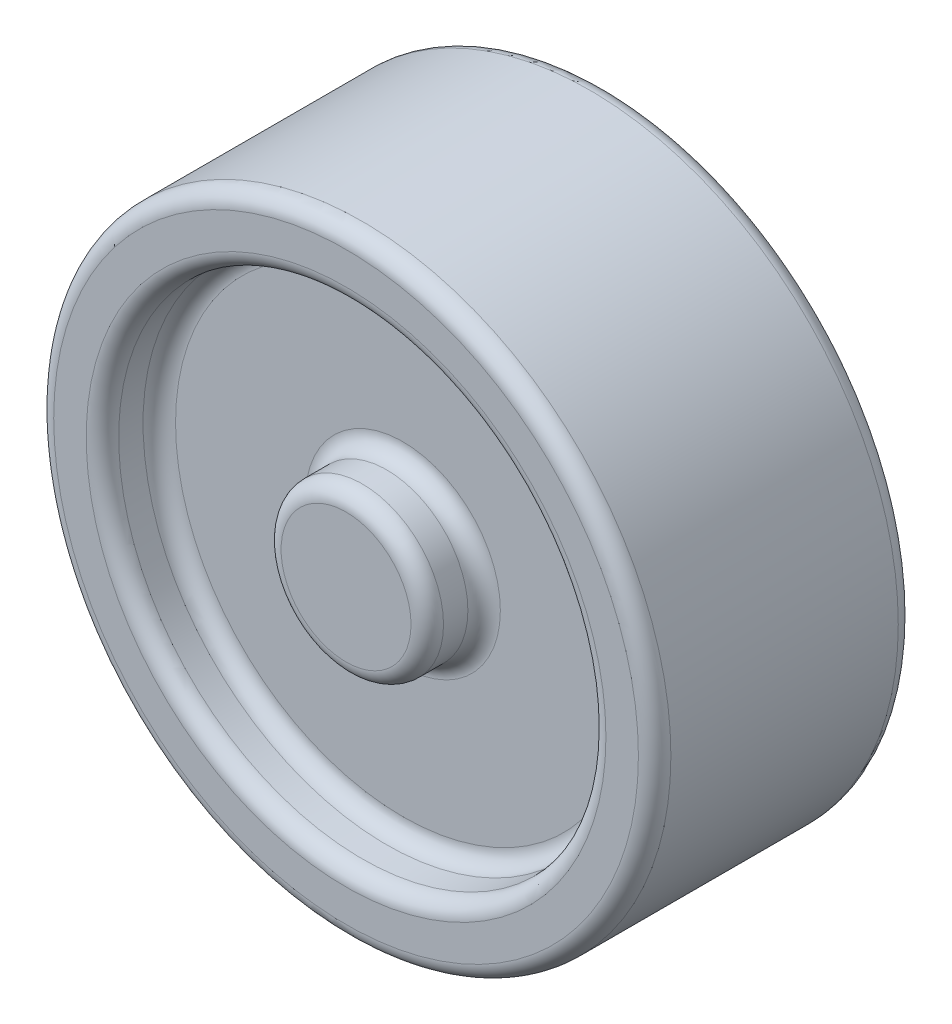
ISO-10303-21;
HEADER;
FILE_DESCRIPTION(('STEP AP214'),'2;1');
FILE_NAME('part.step','',(''),(''),'','','');
FILE_SCHEMA(('AUTOMOTIVE_DESIGN { 1 0 10303 214 1 1 1 1 }'));
ENDSEC;
DATA;
#1=APPLICATION_CONTEXT('core data for automotive mechanical design processes');
#2=APPLICATION_PROTOCOL_DEFINITION('international standard','automotive_design',2000,#1);
#3=PRODUCT_CONTEXT('',#1,'mechanical');
#4=PRODUCT('Part','Part','',(#3));
#5=PRODUCT_RELATED_PRODUCT_CATEGORY('part','',(#4));
#6=PRODUCT_DEFINITION_FORMATION('','',#4);
#7=PRODUCT_DEFINITION_CONTEXT('part definition',#1,'design');
#8=PRODUCT_DEFINITION('design','',#6,#7);
#9=PRODUCT_DEFINITION_SHAPE('','',#8);
#10=(LENGTH_UNIT() NAMED_UNIT(*) SI_UNIT(.MILLI.,.METRE.));
#11=(NAMED_UNIT(*) PLANE_ANGLE_UNIT() SI_UNIT($,.RADIAN.));
#12=(NAMED_UNIT(*) SI_UNIT($,.STERADIAN.) SOLID_ANGLE_UNIT());
#13=UNCERTAINTY_MEASURE_WITH_UNIT(LENGTH_MEASURE(1.E-05),#10,'distance_accuracy_value','');
#14=(GEOMETRIC_REPRESENTATION_CONTEXT(3) GLOBAL_UNCERTAINTY_ASSIGNED_CONTEXT((#13)) GLOBAL_UNIT_ASSIGNED_CONTEXT((#10,
#11,#12)) REPRESENTATION_CONTEXT('',''));
#15=CARTESIAN_POINT('',(0.,0.,0.));
#16=DIRECTION('',(0.,0.,1.));
#17=DIRECTION('',(1.,0.,0.));
#18=AXIS2_PLACEMENT_3D('',#15,#16,#17);
#19=CARTESIAN_POINT('',(0.,0.,8.));
#20=DIRECTION('',(0.,0.,-1.));
#21=DIRECTION('',(-1.,0.,0.));
#22=AXIS2_PLACEMENT_3D('',#19,#20,#21);
#23=CYLINDRICAL_SURFACE('',#22,19.);
#24=CARTESIAN_POINT('',(0.,0.,-7.));
#25=DIRECTION('',(0.,0.,1.));
#26=DIRECTION('',(1.,0.,0.));
#27=AXIS2_PLACEMENT_3D('',#24,#25,#26);
#28=CIRCLE('',#27,19.);
#29=CARTESIAN_POINT('',(19.,0.,-7.));
#30=VERTEX_POINT('',#29);
#31=EDGE_CURVE('E105',#30,#30,#28,.T.);
#32=ORIENTED_EDGE('',*,*,#31,.T.);
#33=EDGE_LOOP('',(#32));
#34=FACE_BOUND('',#33,.T.);
#35=CARTESIAN_POINT('',(0.,0.,7.));
#36=DIRECTION('',(0.,0.,1.));
#37=DIRECTION('',(1.,0.,0.));
#38=AXIS2_PLACEMENT_3D('',#35,#36,#37);
#39=CIRCLE('',#38,19.);
#40=CARTESIAN_POINT('',(19.,0.,7.));
#41=VERTEX_POINT('',#40);
#42=EDGE_CURVE('E108',#41,#41,#39,.F.);
#43=ORIENTED_EDGE('',*,*,#42,.T.);
#44=EDGE_LOOP('',(#43));
#45=FACE_BOUND('',#44,.T.);
#46=ADVANCED_FACE('F43',(#34,#45),#23,.T.);
#47=CARTESIAN_POINT('',(0.,0.,8.));
#48=DIRECTION('',(0.,0.,1.));
#49=DIRECTION('',(1.,0.,0.));
#50=AXIS2_PLACEMENT_3D('',#47,#48,#49);
#51=PLANE('',#50);
#52=CARTESIAN_POINT('',(0.,0.,8.));
#53=DIRECTION('',(0.,0.,1.));
#54=DIRECTION('',(1.,0.,0.));
#55=AXIS2_PLACEMENT_3D('',#52,#53,#54);
#56=CIRCLE('',#55,16.);
#57=CARTESIAN_POINT('',(16.,0.,8.));
#58=VERTEX_POINT('',#57);
#59=EDGE_CURVE('E10',#58,#58,#56,.F.);
#60=ORIENTED_EDGE('',*,*,#59,.T.);
#61=EDGE_LOOP('',(#60));
#62=FACE_BOUND('',#61,.T.);
#63=CARTESIAN_POINT('',(0.,0.,8.));
#64=DIRECTION('',(0.,0.,1.));
#65=DIRECTION('',(1.,0.,0.));
#66=AXIS2_PLACEMENT_3D('',#63,#64,#65);
#67=CIRCLE('',#66,18.);
#68=CARTESIAN_POINT('',(18.,0.,8.));
#69=VERTEX_POINT('',#68);
#70=EDGE_CURVE('E99',#69,#69,#67,.T.);
#71=ORIENTED_EDGE('',*,*,#70,.T.);
#72=EDGE_LOOP('',(#71));
#73=FACE_BOUND('',#72,.T.);
#74=ADVANCED_FACE('F121',(#62,#73),#51,.T.);
#75=CARTESIAN_POINT('',(0.,0.,-8.));
#76=DIRECTION('',(0.,0.,1.));
#77=DIRECTION('',(1.,0.,0.));
#78=AXIS2_PLACEMENT_3D('',#75,#76,#77);
#79=PLANE('',#78);
#80=CARTESIAN_POINT('',(0.,0.,-8.));
#81=DIRECTION('',(0.,0.,1.));
#82=DIRECTION('',(1.,0.,0.));
#83=AXIS2_PLACEMENT_3D('',#80,#81,#82);
#84=CIRCLE('',#83,16.);
#85=CARTESIAN_POINT('',(16.,0.,-8.));
#86=VERTEX_POINT('',#85);
#87=EDGE_CURVE('E75',#86,#86,#84,.T.);
#88=ORIENTED_EDGE('',*,*,#87,.T.);
#89=EDGE_LOOP('',(#88));
#90=FACE_BOUND('',#89,.T.);
#91=CARTESIAN_POINT('',(0.,0.,-8.));
#92=DIRECTION('',(0.,0.,1.));
#93=DIRECTION('',(1.,0.,0.));
#94=AXIS2_PLACEMENT_3D('',#91,#92,#93);
#95=CIRCLE('',#94,18.);
#96=CARTESIAN_POINT('',(18.,0.,-8.));
#97=VERTEX_POINT('',#96);
#98=EDGE_CURVE('E102',#97,#97,#95,.F.);
#99=ORIENTED_EDGE('',*,*,#98,.T.);
#100=EDGE_LOOP('',(#99));
#101=FACE_BOUND('',#100,.T.);
#102=ADVANCED_FACE('F123',(#90,#101),#79,.F.);
#103=CARTESIAN_POINT('',(0.,0.,-7.));
#104=DIRECTION('',(0.,0.,1.));
#105=DIRECTION('',(1.,0.,0.));
#106=AXIS2_PLACEMENT_3D('',#103,#104,#105);
#107=TOROIDAL_SURFACE('',#106,18.,1.);
#108=ORIENTED_EDGE('',*,*,#98,.F.);
#109=EDGE_LOOP('',(#108));
#110=FACE_BOUND('',#109,.T.);
#111=ORIENTED_EDGE('',*,*,#31,.F.);
#112=EDGE_LOOP('',(#111));
#113=FACE_BOUND('',#112,.T.);
#114=ADVANCED_FACE('F117',(#110,#113),#107,.T.);
#115=CARTESIAN_POINT('',(0.,0.,7.));
#116=DIRECTION('',(0.,0.,1.));
#117=DIRECTION('',(1.,0.,0.));
#118=AXIS2_PLACEMENT_3D('',#115,#116,#117);
#119=TOROIDAL_SURFACE('',#118,18.,1.);
#120=ORIENTED_EDGE('',*,*,#42,.F.);
#121=EDGE_LOOP('',(#120));
#122=FACE_BOUND('',#121,.T.);
#123=ORIENTED_EDGE('',*,*,#70,.F.);
#124=EDGE_LOOP('',(#123));
#125=FACE_BOUND('',#124,.T.);
#126=ADVANCED_FACE('F113',(#122,#125),#119,.T.);
#127=CARTESIAN_POINT('',(0.,0.,4.5));
#128=DIRECTION('',(0.,0.,1.));
#129=DIRECTION('',(1.,0.,0.));
#130=AXIS2_PLACEMENT_3D('',#127,#128,#129);
#131=CYLINDRICAL_SURFACE('',#130,15.);
#132=CARTESIAN_POINT('',(0.,0.,5.5));
#133=DIRECTION('',(0.,0.,1.));
#134=DIRECTION('',(1.,0.,0.));
#135=AXIS2_PLACEMENT_3D('',#132,#133,#134);
#136=CIRCLE('',#135,15.);
#137=CARTESIAN_POINT('',(15.,0.,5.5));
#138=VERTEX_POINT('',#137);
#139=EDGE_CURVE('E50',#138,#138,#136,.F.);
#140=ORIENTED_EDGE('',*,*,#139,.T.);
#141=EDGE_LOOP('',(#140));
#142=FACE_BOUND('',#141,.T.);
#143=CARTESIAN_POINT('',(0.,0.,7.));
#144=DIRECTION('',(0.,0.,1.));
#145=DIRECTION('',(1.,0.,0.));
#146=AXIS2_PLACEMENT_3D('',#143,#144,#145);
#147=CIRCLE('',#146,15.);
#148=CARTESIAN_POINT('',(15.,0.,7.));
#149=VERTEX_POINT('',#148);
#150=EDGE_CURVE('E54',#149,#149,#147,.T.);
#151=ORIENTED_EDGE('',*,*,#150,.T.);
#152=EDGE_LOOP('',(#151));
#153=FACE_BOUND('',#152,.T.);
#154=ADVANCED_FACE('F116',(#142,#153),#131,.F.);
#155=CARTESIAN_POINT('',(0.,0.,4.5));
#156=DIRECTION('',(0.,0.,1.));
#157=DIRECTION('',(1.,0.,0.));
#158=AXIS2_PLACEMENT_3D('',#155,#156,#157);
#159=PLANE('',#158);
#160=CARTESIAN_POINT('',(0.,0.,4.5));
#161=DIRECTION('',(0.,0.,1.));
#162=DIRECTION('',(1.,0.,0.));
#163=AXIS2_PLACEMENT_3D('',#160,#161,#162);
#164=CIRCLE('',#163,6.);
#165=CARTESIAN_POINT('',(6.,0.,4.5));
#166=VERTEX_POINT('',#165);
#167=EDGE_CURVE('E63',#166,#166,#164,.F.);
#168=ORIENTED_EDGE('',*,*,#167,.T.);
#169=EDGE_LOOP('',(#168));
#170=FACE_BOUND('',#169,.T.);
#171=CARTESIAN_POINT('',(0.,0.,4.5));
#172=DIRECTION('',(0.,0.,1.));
#173=DIRECTION('',(1.,0.,0.));
#174=AXIS2_PLACEMENT_3D('',#171,#172,#173);
#175=CIRCLE('',#174,14.);
#176=CARTESIAN_POINT('',(14.,0.,4.5));
#177=VERTEX_POINT('',#176);
#178=EDGE_CURVE('E66',#177,#177,#175,.T.);
#179=ORIENTED_EDGE('',*,*,#178,.T.);
#180=EDGE_LOOP('',(#179));
#181=FACE_BOUND('',#180,.T.);
#182=ADVANCED_FACE('F147',(#170,#181),#159,.T.);
#183=CARTESIAN_POINT('',(0.,0.,4.5));
#184=DIRECTION('',(0.,0.,1.));
#185=DIRECTION('',(1.,0.,0.));
#186=AXIS2_PLACEMENT_3D('',#183,#184,#185);
#187=CYLINDRICAL_SURFACE('',#186,5.);
#188=CARTESIAN_POINT('',(0.,0.,5.5));
#189=DIRECTION('',(0.,0.,1.));
#190=DIRECTION('',(1.,0.,0.));
#191=AXIS2_PLACEMENT_3D('',#188,#189,#190);
#192=CIRCLE('',#191,5.);
#193=CARTESIAN_POINT('',(5.,0.,5.5));
#194=VERTEX_POINT('',#193);
#195=EDGE_CURVE('E69',#194,#194,#192,.T.);
#196=ORIENTED_EDGE('',*,*,#195,.T.);
#197=EDGE_LOOP('',(#196));
#198=FACE_BOUND('',#197,.T.);
#199=CARTESIAN_POINT('',(0.,0.,7.));
#200=DIRECTION('',(0.,0.,1.));
#201=DIRECTION('',(1.,0.,0.));
#202=AXIS2_PLACEMENT_3D('',#199,#200,#201);
#203=CIRCLE('',#202,5.);
#204=CARTESIAN_POINT('',(5.,0.,7.));
#205=VERTEX_POINT('',#204);
#206=EDGE_CURVE('E72',#205,#205,#203,.F.);
#207=ORIENTED_EDGE('',*,*,#206,.T.);
#208=EDGE_LOOP('',(#207));
#209=FACE_BOUND('',#208,.T.);
#210=ADVANCED_FACE('F138',(#198,#209),#187,.T.);
#211=CARTESIAN_POINT('',(0.,0.,8.));
#212=DIRECTION('',(0.,0.,1.));
#213=DIRECTION('',(1.,0.,0.));
#214=AXIS2_PLACEMENT_3D('',#211,#212,#213);
#215=CIRCLE('',#214,4.);
#216=CARTESIAN_POINT('',(4.,0.,8.));
#217=VERTEX_POINT('',#216);
#218=EDGE_CURVE('E58',#217,#217,#215,.T.);
#219=ORIENTED_EDGE('',*,*,#218,.T.);
#220=EDGE_LOOP('',(#219));
#221=FACE_BOUND('',#220,.T.);
#222=ADVANCED_FACE('F125',(#221),#51,.T.);
#223=CARTESIAN_POINT('',(0.,0.,-4.5));
#224=DIRECTION('',(0.,0.,-1.));
#225=DIRECTION('',(1.,0.,0.));
#226=AXIS2_PLACEMENT_3D('',#223,#224,#225);
#227=PLANE('',#226);
#228=CARTESIAN_POINT('',(0.,0.,-4.5));
#229=DIRECTION('',(0.,0.,-1.));
#230=DIRECTION('',(-1.,0.,0.));
#231=AXIS2_PLACEMENT_3D('',#228,#229,#230);
#232=CIRCLE('',#231,6.);
#233=CARTESIAN_POINT('',(-6.,0.,-4.5));
#234=VERTEX_POINT('',#233);
#235=EDGE_CURVE('E84',#234,#234,#232,.F.);
#236=ORIENTED_EDGE('',*,*,#235,.T.);
#237=EDGE_LOOP('',(#236));
#238=FACE_BOUND('',#237,.T.);
#239=CARTESIAN_POINT('',(0.,0.,-4.5));
#240=DIRECTION('',(0.,0.,-1.));
#241=DIRECTION('',(-1.,0.,0.));
#242=AXIS2_PLACEMENT_3D('',#239,#240,#241);
#243=CIRCLE('',#242,14.);
#244=CARTESIAN_POINT('',(-14.,0.,-4.5));
#245=VERTEX_POINT('',#244);
#246=EDGE_CURVE('E87',#245,#245,#243,.T.);
#247=ORIENTED_EDGE('',*,*,#246,.T.);
#248=EDGE_LOOP('',(#247));
#249=FACE_BOUND('',#248,.T.);
#250=ADVANCED_FACE('F137',(#238,#249),#227,.T.);
#251=CARTESIAN_POINT('',(0.,0.,-4.5));
#252=DIRECTION('',(0.,0.,-1.));
#253=DIRECTION('',(-1.,0.,0.));
#254=AXIS2_PLACEMENT_3D('',#251,#252,#253);
#255=CYLINDRICAL_SURFACE('',#254,15.);
#256=CARTESIAN_POINT('',(0.,0.,-5.5));
#257=DIRECTION('',(0.,0.,-1.));
#258=DIRECTION('',(-1.,0.,0.));
#259=AXIS2_PLACEMENT_3D('',#256,#257,#258);
#260=CIRCLE('',#259,15.);
#261=CARTESIAN_POINT('',(-15.,0.,-5.5));
#262=VERTEX_POINT('',#261);
#263=EDGE_CURVE('E78',#262,#262,#260,.F.);
#264=ORIENTED_EDGE('',*,*,#263,.T.);
#265=EDGE_LOOP('',(#264));
#266=FACE_BOUND('',#265,.T.);
#267=CARTESIAN_POINT('',(0.,0.,-7.));
#268=DIRECTION('',(0.,0.,1.));
#269=DIRECTION('',(1.,0.,0.));
#270=AXIS2_PLACEMENT_3D('',#267,#268,#269);
#271=CIRCLE('',#270,15.);
#272=CARTESIAN_POINT('',(15.,0.,-7.));
#273=VERTEX_POINT('',#272);
#274=EDGE_CURVE('E81',#273,#273,#271,.F.);
#275=ORIENTED_EDGE('',*,*,#274,.T.);
#276=EDGE_LOOP('',(#275));
#277=FACE_BOUND('',#276,.T.);
#278=ADVANCED_FACE('F144',(#266,#277),#255,.F.);
#279=CARTESIAN_POINT('',(0.,0.,-4.5));
#280=DIRECTION('',(0.,0.,-1.));
#281=DIRECTION('',(-1.,0.,0.));
#282=AXIS2_PLACEMENT_3D('',#279,#280,#281);
#283=CYLINDRICAL_SURFACE('',#282,5.);
#284=CARTESIAN_POINT('',(0.,0.,-7.));
#285=DIRECTION('',(0.,0.,1.));
#286=DIRECTION('',(1.,0.,0.));
#287=AXIS2_PLACEMENT_3D('',#284,#285,#286);
#288=CIRCLE('',#287,5.);
#289=CARTESIAN_POINT('',(5.,0.,-7.));
#290=VERTEX_POINT('',#289);
#291=EDGE_CURVE('E93',#290,#290,#288,.T.);
#292=ORIENTED_EDGE('',*,*,#291,.T.);
#293=EDGE_LOOP('',(#292));
#294=FACE_BOUND('',#293,.T.);
#295=CARTESIAN_POINT('',(0.,0.,-5.5));
#296=DIRECTION('',(0.,0.,-1.));
#297=DIRECTION('',(-1.,0.,0.));
#298=AXIS2_PLACEMENT_3D('',#295,#296,#297);
#299=CIRCLE('',#298,5.);
#300=CARTESIAN_POINT('',(-5.,0.,-5.5));
#301=VERTEX_POINT('',#300);
#302=EDGE_CURVE('E96',#301,#301,#299,.T.);
#303=ORIENTED_EDGE('',*,*,#302,.T.);
#304=EDGE_LOOP('',(#303));
#305=FACE_BOUND('',#304,.T.);
#306=ADVANCED_FACE('F234',(#294,#305),#283,.T.);
#307=CARTESIAN_POINT('',(0.,0.,-8.));
#308=DIRECTION('',(0.,0.,1.));
#309=DIRECTION('',(1.,0.,0.));
#310=AXIS2_PLACEMENT_3D('',#307,#308,#309);
#311=CIRCLE('',#310,4.);
#312=CARTESIAN_POINT('',(4.,0.,-8.));
#313=VERTEX_POINT('',#312);
#314=EDGE_CURVE('E90',#313,#313,#311,.F.);
#315=ORIENTED_EDGE('',*,*,#314,.T.);
#316=EDGE_LOOP('',(#315));
#317=FACE_BOUND('',#316,.T.);
#318=ADVANCED_FACE('F132',(#317),#79,.F.);
#319=CARTESIAN_POINT('',(0.,0.,-7.));
#320=DIRECTION('',(0.,0.,1.));
#321=DIRECTION('',(1.,0.,0.));
#322=AXIS2_PLACEMENT_3D('',#319,#320,#321);
#323=TOROIDAL_SURFACE('',#322,4.,1.);
#324=ORIENTED_EDGE('',*,*,#314,.F.);
#325=EDGE_LOOP('',(#324));
#326=FACE_BOUND('',#325,.T.);
#327=ORIENTED_EDGE('',*,*,#291,.F.);
#328=EDGE_LOOP('',(#327));
#329=FACE_BOUND('',#328,.T.);
#330=ADVANCED_FACE('F178',(#326,#329),#323,.T.);
#331=CARTESIAN_POINT('',(0.,0.,-5.5));
#332=DIRECTION('',(0.,0.,-1.));
#333=DIRECTION('',(-1.,0.,0.));
#334=AXIS2_PLACEMENT_3D('',#331,#332,#333);
#335=TOROIDAL_SURFACE('',#334,6.,1.);
#336=ORIENTED_EDGE('',*,*,#302,.F.);
#337=EDGE_LOOP('',(#336));
#338=FACE_BOUND('',#337,.T.);
#339=ORIENTED_EDGE('',*,*,#235,.F.);
#340=EDGE_LOOP('',(#339));
#341=FACE_BOUND('',#340,.T.);
#342=ADVANCED_FACE('F174',(#338,#341),#335,.F.);
#343=CARTESIAN_POINT('',(0.,0.,-5.5));
#344=DIRECTION('',(0.,0.,-1.));
#345=DIRECTION('',(-1.,0.,0.));
#346=AXIS2_PLACEMENT_3D('',#343,#344,#345);
#347=TOROIDAL_SURFACE('',#346,14.,1.);
#348=ORIENTED_EDGE('',*,*,#246,.F.);
#349=EDGE_LOOP('',(#348));
#350=FACE_BOUND('',#349,.T.);
#351=ORIENTED_EDGE('',*,*,#263,.F.);
#352=EDGE_LOOP('',(#351));
#353=FACE_BOUND('',#352,.T.);
#354=ADVANCED_FACE('F170',(#350,#353),#347,.F.);
#355=CARTESIAN_POINT('',(0.,0.,-7.));
#356=DIRECTION('',(0.,0.,1.));
#357=DIRECTION('',(1.,0.,0.));
#358=AXIS2_PLACEMENT_3D('',#355,#356,#357);
#359=TOROIDAL_SURFACE('',#358,16.,1.);
#360=ORIENTED_EDGE('',*,*,#274,.F.);
#361=EDGE_LOOP('',(#360));
#362=FACE_BOUND('',#361,.T.);
#363=ORIENTED_EDGE('',*,*,#87,.F.);
#364=EDGE_LOOP('',(#363));
#365=FACE_BOUND('',#364,.T.);
#366=ADVANCED_FACE('F163',(#362,#365),#359,.T.);
#367=CARTESIAN_POINT('',(0.,0.,5.5));
#368=DIRECTION('',(0.,0.,1.));
#369=DIRECTION('',(1.,0.,0.));
#370=AXIS2_PLACEMENT_3D('',#367,#368,#369);
#371=TOROIDAL_SURFACE('',#370,6.,1.);
#372=ORIENTED_EDGE('',*,*,#167,.F.);
#373=EDGE_LOOP('',(#372));
#374=FACE_BOUND('',#373,.T.);
#375=ORIENTED_EDGE('',*,*,#195,.F.);
#376=EDGE_LOOP('',(#375));
#377=FACE_BOUND('',#376,.T.);
#378=ADVANCED_FACE('F155',(#374,#377),#371,.F.);
#379=CARTESIAN_POINT('',(0.,0.,7.));
#380=DIRECTION('',(0.,0.,1.));
#381=DIRECTION('',(1.,0.,0.));
#382=AXIS2_PLACEMENT_3D('',#379,#380,#381);
#383=TOROIDAL_SURFACE('',#382,4.,1.);
#384=ORIENTED_EDGE('',*,*,#206,.F.);
#385=EDGE_LOOP('',(#384));
#386=FACE_BOUND('',#385,.T.);
#387=ORIENTED_EDGE('',*,*,#218,.F.);
#388=EDGE_LOOP('',(#387));
#389=FACE_BOUND('',#388,.T.);
#390=ADVANCED_FACE('F152',(#386,#389),#383,.T.);
#391=CARTESIAN_POINT('',(0.,0.,5.5));
#392=DIRECTION('',(0.,0.,1.));
#393=DIRECTION('',(1.,0.,0.));
#394=AXIS2_PLACEMENT_3D('',#391,#392,#393);
#395=TOROIDAL_SURFACE('',#394,14.,1.);
#396=ORIENTED_EDGE('',*,*,#139,.F.);
#397=EDGE_LOOP('',(#396));
#398=FACE_BOUND('',#397,.T.);
#399=ORIENTED_EDGE('',*,*,#178,.F.);
#400=EDGE_LOOP('',(#399));
#401=FACE_BOUND('',#400,.T.);
#402=ADVANCED_FACE('F154',(#398,#401),#395,.F.);
#403=CARTESIAN_POINT('',(0.,0.,7.));
#404=DIRECTION('',(0.,0.,1.));
#405=DIRECTION('',(1.,0.,0.));
#406=AXIS2_PLACEMENT_3D('',#403,#404,#405);
#407=TOROIDAL_SURFACE('',#406,16.,1.);
#408=ORIENTED_EDGE('',*,*,#59,.F.);
#409=EDGE_LOOP('',(#408));
#410=FACE_BOUND('',#409,.T.);
#411=ORIENTED_EDGE('',*,*,#150,.F.);
#412=EDGE_LOOP('',(#411));
#413=FACE_BOUND('',#412,.T.);
#414=ADVANCED_FACE('F45',(#410,#413),#407,.T.);
#415=CLOSED_SHELL('',(#46,#74,#102,#114,#126,#154,#182,#210,#222,#250,#278,#306,#318,#330,#342,
#354,#366,#378,#390,#402,#414));
#416=MANIFOLD_SOLID_BREP('B2',#415);
#417=ADVANCED_BREP_SHAPE_REPRESENTATION('',(#18,#416),#14);
#418=SHAPE_DEFINITION_REPRESENTATION(#9,#417);
ENDSEC;
END-ISO-10303-21;
